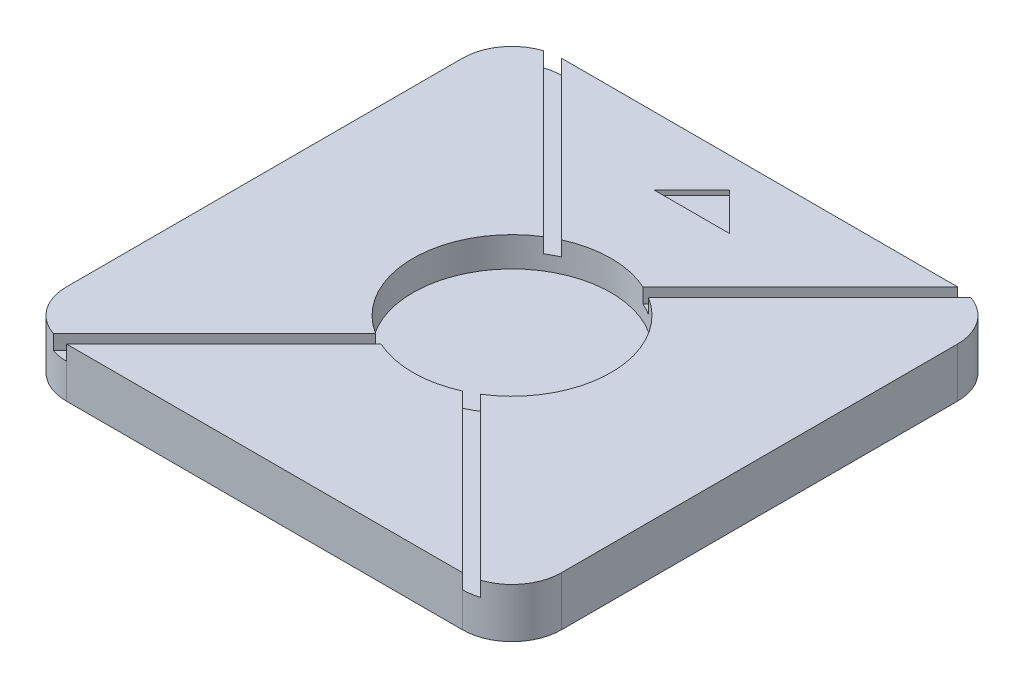
ISO-10303-21;
HEADER;
FILE_DESCRIPTION(('STEP AP214'),'2;1');
FILE_NAME('part.step','',(''),(''),'','','');
FILE_SCHEMA(('AUTOMOTIVE_DESIGN { 1 0 10303 214 1 1 1 1 }'));
ENDSEC;
DATA;
#1=APPLICATION_CONTEXT('core data for automotive mechanical design processes');
#2=APPLICATION_PROTOCOL_DEFINITION('international standard','automotive_design',2000,#1);
#3=PRODUCT_CONTEXT('',#1,'mechanical');
#4=PRODUCT('Part','Part','',(#3));
#5=PRODUCT_RELATED_PRODUCT_CATEGORY('part','',(#4));
#6=PRODUCT_DEFINITION_FORMATION('','',#4);
#7=PRODUCT_DEFINITION_CONTEXT('part definition',#1,'design');
#8=PRODUCT_DEFINITION('design','',#6,#7);
#9=PRODUCT_DEFINITION_SHAPE('','',#8);
#10=(LENGTH_UNIT() NAMED_UNIT(*) SI_UNIT(.MILLI.,.METRE.));
#11=(NAMED_UNIT(*) PLANE_ANGLE_UNIT() SI_UNIT($,.RADIAN.));
#12=(NAMED_UNIT(*) SI_UNIT($,.STERADIAN.) SOLID_ANGLE_UNIT());
#13=UNCERTAINTY_MEASURE_WITH_UNIT(LENGTH_MEASURE(1.E-05),#10,'distance_accuracy_value','');
#14=(GEOMETRIC_REPRESENTATION_CONTEXT(3) GLOBAL_UNCERTAINTY_ASSIGNED_CONTEXT((#13)) GLOBAL_UNIT_ASSIGNED_CONTEXT((#10,
#11,#12)) REPRESENTATION_CONTEXT('',''));
#15=CARTESIAN_POINT('',(0.,0.,0.));
#16=DIRECTION('',(0.,0.,1.));
#17=DIRECTION('',(1.,0.,0.));
#18=AXIS2_PLACEMENT_3D('',#15,#16,#17);
#19=CARTESIAN_POINT('',(-61.551724137931,10.,40.0000000000001));
#20=DIRECTION('',(0.,-1.,0.));
#21=DIRECTION('',(0.,0.,-1.));
#22=AXIS2_PLACEMENT_3D('',#19,#20,#21);
#23=PLANE('',#22);
#24=DIRECTION('',(0.707106781186547,0.,-0.707106781186548));
#25=VECTOR('',#24,1.);
#26=CARTESIAN_POINT('',(-13.9373844378805,10.,-13.9373844378805));
#27=LINE('',#26,#25);
#28=CARTESIAN_POINT('',(-10.9290245008404,10.,-16.9457443749206));
#29=VERTEX_POINT('',#28);
#30=CARTESIAN_POINT('',(21.6116864027467,10.,-49.4864552785077));
#31=VERTEX_POINT('',#30);
#32=EDGE_CURVE('E308',#29,#31,#27,.T.);
#33=ORIENTED_EDGE('',*,*,#32,.F.);
#34=CARTESIAN_POINT('',(-21.551724137931,10.,0.));
#35=DIRECTION('',(0.,1.,0.));
#36=DIRECTION('',(0.,0.,1.));
#37=AXIS2_PLACEMENT_3D('',#34,#35,#36);
#38=CIRCLE('',#37,20.);
#39=CARTESIAN_POINT('',(-10.9290245008404,10.,16.9457443749207));
#40=VERTEX_POINT('',#39);
#41=EDGE_CURVE('E249',#40,#29,#38,.T.);
#42=ORIENTED_EDGE('',*,*,#41,.F.);
#43=DIRECTION('',(0.707106781186548,0.,0.707106781186547));
#44=VECTOR('',#43,1.);
#45=CARTESIAN_POINT('',(-13.9373844378805,10.,13.9373844378806));
#46=LINE('',#45,#44);
#47=CARTESIAN_POINT('',(21.6116864027468,10.,49.4864552785079));
#48=VERTEX_POINT('',#47);
#49=EDGE_CURVE('E281',#40,#48,#46,.T.);
#50=ORIENTED_EDGE('',*,*,#49,.T.);
#51=CARTESIAN_POINT('',(18.448275862069,10.,40.0000000000001));
#52=DIRECTION('',(0.,1.,0.));
#53=DIRECTION('',(0.,0.,1.));
#54=AXIS2_PLACEMENT_3D('',#51,#52,#53);
#55=CIRCLE('',#54,10.);
#56=CARTESIAN_POINT('',(28.448275862069,10.,40.));
#57=VERTEX_POINT('',#56);
#58=EDGE_CURVE('E377',#48,#57,#55,.T.);
#59=ORIENTED_EDGE('',*,*,#58,.T.);
#60=DIRECTION('',(0.,0.,-1.));
#61=VECTOR('',#60,1.);
#62=CARTESIAN_POINT('',(28.448275862069,10.,-39.9999999999998));
#63=LINE('',#62,#61);
#64=CARTESIAN_POINT('',(28.448275862069,10.,-39.9999999999998));
#65=VERTEX_POINT('',#64);
#66=EDGE_CURVE('E380',#57,#65,#63,.T.);
#67=ORIENTED_EDGE('',*,*,#66,.T.);
#68=CARTESIAN_POINT('',(18.448275862069,10.,-39.9999999999999));
#69=DIRECTION('',(0.,1.,0.));
#70=DIRECTION('',(0.,0.,1.));
#71=AXIS2_PLACEMENT_3D('',#68,#69,#70);
#72=CIRCLE('',#71,10.);
#73=EDGE_CURVE('E383',#65,#31,#72,.T.);
#74=ORIENTED_EDGE('',*,*,#73,.T.);
#75=EDGE_LOOP('',(#33,#42,#50,#59,#67,#74));
#76=FACE_BOUND('',#75,.T.);
#77=ADVANCED_FACE('F39',(#76),#23,.F.);
#78=CARTESIAN_POINT('',(0.,7.,0.));
#79=DIRECTION('',(0.,1.,0.));
#80=DIRECTION('',(0.,0.,1.));
#81=AXIS2_PLACEMENT_3D('',#78,#79,#80);
#82=PLANE('',#81);
#83=CARTESIAN_POINT('',(-21.551724137931,7.,0.));
#84=DIRECTION('',(0.,1.,0.));
#85=DIRECTION('',(0.,0.,1.));
#86=AXIS2_PLACEMENT_3D('',#83,#84,#85);
#87=CIRCLE('',#86,20.);
#88=CARTESIAN_POINT('',(-13.3229675826081,7.,18.228756555323));
#89=VERTEX_POINT('',#88);
#90=CARTESIAN_POINT('',(-10.9290245008404,7.,16.9457443749207));
#91=VERTEX_POINT('',#90);
#92=EDGE_CURVE('E269',#89,#91,#87,.T.);
#93=ORIENTED_EDGE('',*,*,#92,.F.);
#94=DIRECTION('',(-0.707106781186549,0.,-0.707106781186546));
#95=VECTOR('',#94,1.);
#96=CARTESIAN_POINT('',(-15.7758620689655,7.,15.7758620689656));
#97=LINE('',#96,#95);
#98=CARTESIAN_POINT('',(18.448275862069,7.,50.0000000000001));
#99=VERTEX_POINT('',#98);
#100=EDGE_CURVE('E341',#99,#89,#97,.T.);
#101=ORIENTED_EDGE('',*,*,#100,.F.);
#102=CARTESIAN_POINT('',(18.448275862069,7.,40.0000000000001));
#103=DIRECTION('',(0.,1.,0.));
#104=DIRECTION('',(0.,0.,1.));
#105=AXIS2_PLACEMENT_3D('',#102,#103,#104);
#106=CIRCLE('',#105,10.);
#107=CARTESIAN_POINT('',(21.6116864027468,7.,49.4864552785079));
#108=VERTEX_POINT('',#107);
#109=EDGE_CURVE('E345',#99,#108,#106,.T.);
#110=ORIENTED_EDGE('',*,*,#109,.T.);
#111=DIRECTION('',(0.707106781186548,0.,0.707106781186547));
#112=VECTOR('',#111,1.);
#113=CARTESIAN_POINT('',(-13.9373844378805,7.,13.9373844378806));
#114=LINE('',#113,#112);
#115=EDGE_CURVE('E326',#91,#108,#114,.T.);
#116=ORIENTED_EDGE('',*,*,#115,.F.);
#117=EDGE_LOOP('',(#93,#101,#110,#116));
#118=FACE_BOUND('',#117,.T.);
#119=ADVANCED_FACE('F561',(#118),#82,.T.);
#120=CARTESIAN_POINT('',(0.,7.,0.));
#121=DIRECTION('',(0.,1.,0.));
#122=DIRECTION('',(0.,0.,1.));
#123=AXIS2_PLACEMENT_3D('',#120,#121,#122);
#124=PLANE('',#123);
#125=CARTESIAN_POINT('',(-21.551724137931,7.,0.));
#126=DIRECTION('',(0.,1.,0.));
#127=DIRECTION('',(0.,0.,1.));
#128=AXIS2_PLACEMENT_3D('',#125,#126,#127);
#129=CIRCLE('',#128,20.);
#130=CARTESIAN_POINT('',(-10.9290245008404,7.,-16.9457443749206));
#131=VERTEX_POINT('',#130);
#132=CARTESIAN_POINT('',(-13.3229675826081,7.,-18.2287565553229));
#133=VERTEX_POINT('',#132);
#134=EDGE_CURVE('E11',#131,#133,#129,.T.);
#135=ORIENTED_EDGE('',*,*,#134,.F.);
#136=DIRECTION('',(0.707106781186547,0.,-0.707106781186548));
#137=VECTOR('',#136,1.);
#138=CARTESIAN_POINT('',(-13.9373844378805,7.,-13.9373844378805));
#139=LINE('',#138,#137);
#140=CARTESIAN_POINT('',(21.6116864027467,7.,-49.4864552785077));
#141=VERTEX_POINT('',#140);
#142=EDGE_CURVE('E285',#131,#141,#139,.T.);
#143=ORIENTED_EDGE('',*,*,#142,.T.);
#144=CARTESIAN_POINT('',(18.448275862069,7.,-39.9999999999999));
#145=DIRECTION('',(0.,1.,0.));
#146=DIRECTION('',(0.,0.,1.));
#147=AXIS2_PLACEMENT_3D('',#144,#145,#146);
#148=CIRCLE('',#147,10.);
#149=CARTESIAN_POINT('',(18.4482758620689,7.,-49.9999999999999));
#150=VERTEX_POINT('',#149);
#151=EDGE_CURVE('E289',#141,#150,#148,.T.);
#152=ORIENTED_EDGE('',*,*,#151,.T.);
#153=DIRECTION('',(0.707106781186548,0.,-0.707106781186547));
#154=VECTOR('',#153,1.);
#155=CARTESIAN_POINT('',(-15.7758620689655,7.,-15.7758620689655));
#156=LINE('',#155,#154);
#157=EDGE_CURVE('E293',#133,#150,#156,.T.);
#158=ORIENTED_EDGE('',*,*,#157,.F.);
#159=EDGE_LOOP('',(#135,#143,#152,#158));
#160=FACE_BOUND('',#159,.T.);
#161=ADVANCED_FACE('F546',(#160),#124,.T.);
#162=CARTESIAN_POINT('',(-61.551724137931,10.,40.0000000000001));
#163=DIRECTION('',(0.,-1.,0.));
#164=DIRECTION('',(0.,0.,-1.));
#165=AXIS2_PLACEMENT_3D('',#162,#163,#164);
#166=CYLINDRICAL_SURFACE('',#165,10.);
#167=DIRECTION('',(0.,1.,0.));
#168=VECTOR('',#167,1.);
#169=CARTESIAN_POINT('',(-64.7151346786088,7.,49.4864552785079));
#170=LINE('',#169,#168);
#171=CARTESIAN_POINT('',(-64.7151346786088,7.,49.4864552785079));
#172=VERTEX_POINT('',#171);
#173=CARTESIAN_POINT('',(-64.7151346786088,10.,49.4864552785079));
#174=VERTEX_POINT('',#173);
#175=EDGE_CURVE('E349',#172,#174,#170,.T.);
#176=ORIENTED_EDGE('',*,*,#175,.T.);
#177=CARTESIAN_POINT('',(-61.551724137931,10.,40.0000000000001));
#178=DIRECTION('',(0.,1.,0.));
#179=DIRECTION('',(0.,0.,-1.));
#180=AXIS2_PLACEMENT_3D('',#177,#178,#179);
#181=CIRCLE('',#180,10.);
#182=CARTESIAN_POINT('',(-71.551724137931,10.,40.));
#183=VERTEX_POINT('',#182);
#184=EDGE_CURVE('E368',#183,#174,#181,.T.);
#185=ORIENTED_EDGE('',*,*,#184,.F.);
#186=DIRECTION('',(0.,-1.,0.));
#187=VECTOR('',#186,1.);
#188=CARTESIAN_POINT('',(-71.551724137931,10.,40.));
#189=LINE('',#188,#187);
#190=CARTESIAN_POINT('',(-71.551724137931,0.,40.));
#191=VERTEX_POINT('',#190);
#192=EDGE_CURVE('E397',#183,#191,#189,.T.);
#193=ORIENTED_EDGE('',*,*,#192,.T.);
#194=CARTESIAN_POINT('',(-61.551724137931,0.,40.0000000000001));
#195=DIRECTION('',(0.,1.,0.));
#196=DIRECTION('',(0.,0.,-1.));
#197=AXIS2_PLACEMENT_3D('',#194,#195,#196);
#198=CIRCLE('',#197,10.);
#199=CARTESIAN_POINT('',(-61.551724137931,0.,50.0000000000001));
#200=VERTEX_POINT('',#199);
#201=EDGE_CURVE('E322',#191,#200,#198,.T.);
#202=ORIENTED_EDGE('',*,*,#201,.T.);
#203=DIRECTION('',(0.,-1.,0.));
#204=VECTOR('',#203,1.);
#205=CARTESIAN_POINT('',(-61.551724137931,10.,50.0000000000001));
#206=LINE('',#205,#204);
#207=CARTESIAN_POINT('',(-61.551724137931,7.,50.0000000000001));
#208=VERTEX_POINT('',#207);
#209=EDGE_CURVE('E451',#208,#200,#206,.T.);
#210=ORIENTED_EDGE('',*,*,#209,.F.);
#211=CARTESIAN_POINT('',(-61.551724137931,7.,40.0000000000001));
#212=DIRECTION('',(0.,1.,0.));
#213=DIRECTION('',(0.,0.,1.));
#214=AXIS2_PLACEMENT_3D('',#211,#212,#213);
#215=CIRCLE('',#214,10.);
#216=EDGE_CURVE('E334',#172,#208,#215,.T.);
#217=ORIENTED_EDGE('',*,*,#216,.F.);
#218=EDGE_LOOP('',(#176,#185,#193,#202,#210,#217));
#219=FACE_BOUND('',#218,.T.);
#220=ADVANCED_FACE('F41',(#219),#166,.T.);
#221=CARTESIAN_POINT('',(18.448275862069,10.,40.0000000000001));
#222=DIRECTION('',(0.,-1.,0.));
#223=DIRECTION('',(0.,0.,-1.));
#224=AXIS2_PLACEMENT_3D('',#221,#222,#223);
#225=CYLINDRICAL_SURFACE('',#224,10.);
#226=DIRECTION('',(0.,1.,0.));
#227=VECTOR('',#226,1.);
#228=CARTESIAN_POINT('',(21.6116864027468,7.,49.4864552785079));
#229=LINE('',#228,#227);
#230=EDGE_CURVE('E309',#108,#48,#229,.T.);
#231=ORIENTED_EDGE('',*,*,#230,.F.);
#232=ORIENTED_EDGE('',*,*,#109,.F.);
#233=DIRECTION('',(0.,-1.,0.));
#234=VECTOR('',#233,1.);
#235=CARTESIAN_POINT('',(18.4482758620689,10.,50.0000000000001));
#236=LINE('',#235,#234);
#237=CARTESIAN_POINT('',(18.4482758620689,0.,50.0000000000001));
#238=VERTEX_POINT('',#237);
#239=EDGE_CURVE('E448',#99,#238,#236,.T.);
#240=ORIENTED_EDGE('',*,*,#239,.T.);
#241=CARTESIAN_POINT('',(18.448275862069,0.,40.0000000000001));
#242=DIRECTION('',(0.,1.,0.));
#243=DIRECTION('',(0.,0.,1.));
#244=AXIS2_PLACEMENT_3D('',#241,#242,#243);
#245=CIRCLE('',#244,10.);
#246=CARTESIAN_POINT('',(28.448275862069,0.,40.));
#247=VERTEX_POINT('',#246);
#248=EDGE_CURVE('E405',#238,#247,#245,.T.);
#249=ORIENTED_EDGE('',*,*,#248,.T.);
#250=DIRECTION('',(0.,-1.,0.));
#251=VECTOR('',#250,1.);
#252=CARTESIAN_POINT('',(28.448275862069,10.,40.));
#253=LINE('',#252,#251);
#254=EDGE_CURVE('E444',#57,#247,#253,.T.);
#255=ORIENTED_EDGE('',*,*,#254,.F.);
#256=ORIENTED_EDGE('',*,*,#58,.F.);
#257=EDGE_LOOP('',(#231,#232,#240,#249,#255,#256));
#258=FACE_BOUND('',#257,.T.);
#259=ADVANCED_FACE('F507',(#258),#225,.T.);
#260=CARTESIAN_POINT('',(-61.551724137931,10.,-39.9999999999999));
#261=DIRECTION('',(0.,-1.,0.));
#262=DIRECTION('',(0.,0.,-1.));
#263=AXIS2_PLACEMENT_3D('',#260,#261,#262);
#264=CYLINDRICAL_SURFACE('',#263,10.);
#265=DIRECTION('',(0.,1.,0.));
#266=VECTOR('',#265,1.);
#267=CARTESIAN_POINT('',(-64.7151346786088,7.,-49.4864552785077));
#268=LINE('',#267,#266);
#269=CARTESIAN_POINT('',(-64.7151346786088,7.,-49.4864552785077));
#270=VERTEX_POINT('',#269);
#271=CARTESIAN_POINT('',(-64.7151346786088,10.,-49.4864552785077));
#272=VERTEX_POINT('',#271);
#273=EDGE_CURVE('E318',#270,#272,#268,.T.);
#274=ORIENTED_EDGE('',*,*,#273,.F.);
#275=CARTESIAN_POINT('',(-61.551724137931,7.,-39.9999999999999));
#276=DIRECTION('',(0.,1.,0.));
#277=DIRECTION('',(0.,0.,1.));
#278=AXIS2_PLACEMENT_3D('',#275,#276,#277);
#279=CIRCLE('',#278,10.);
#280=CARTESIAN_POINT('',(-61.551724137931,7.,-49.9999999999999));
#281=VERTEX_POINT('',#280);
#282=EDGE_CURVE('E300',#281,#270,#279,.T.);
#283=ORIENTED_EDGE('',*,*,#282,.F.);
#284=DIRECTION('',(0.,-1.,0.));
#285=VECTOR('',#284,1.);
#286=CARTESIAN_POINT('',(-61.551724137931,10.,-49.9999999999999));
#287=LINE('',#286,#285);
#288=CARTESIAN_POINT('',(-61.551724137931,0.,-49.9999999999999));
#289=VERTEX_POINT('',#288);
#290=EDGE_CURVE('E431',#281,#289,#287,.T.);
#291=ORIENTED_EDGE('',*,*,#290,.T.);
#292=CARTESIAN_POINT('',(-61.551724137931,0.,-39.9999999999999));
#293=DIRECTION('',(0.,1.,0.));
#294=DIRECTION('',(0.,0.,1.));
#295=AXIS2_PLACEMENT_3D('',#292,#293,#294);
#296=CIRCLE('',#295,10.);
#297=CARTESIAN_POINT('',(-71.551724137931,0.,-39.9999999999998));
#298=VERTEX_POINT('',#297);
#299=EDGE_CURVE('E419',#289,#298,#296,.T.);
#300=ORIENTED_EDGE('',*,*,#299,.T.);
#301=DIRECTION('',(0.,-1.,0.));
#302=VECTOR('',#301,1.);
#303=CARTESIAN_POINT('',(-71.551724137931,10.,-39.9999999999998));
#304=LINE('',#303,#302);
#305=CARTESIAN_POINT('',(-71.551724137931,10.,-39.9999999999998));
#306=VERTEX_POINT('',#305);
#307=EDGE_CURVE('E427',#306,#298,#304,.T.);
#308=ORIENTED_EDGE('',*,*,#307,.F.);
#309=CARTESIAN_POINT('',(-61.551724137931,10.,-39.9999999999999));
#310=DIRECTION('',(0.,1.,0.));
#311=DIRECTION('',(0.,0.,1.));
#312=AXIS2_PLACEMENT_3D('',#309,#310,#311);
#313=CIRCLE('',#312,10.);
#314=EDGE_CURVE('E391',#272,#306,#313,.T.);
#315=ORIENTED_EDGE('',*,*,#314,.F.);
#316=EDGE_LOOP('',(#274,#283,#291,#300,#308,#315));
#317=FACE_BOUND('',#316,.T.);
#318=ADVANCED_FACE('F483',(#317),#264,.T.);
#319=DIRECTION('',(-0.707106781186548,0.,0.707106781186547));
#320=VECTOR('',#319,1.);
#321=CARTESIAN_POINT('',(-21.551724137931,10.,-43.9409498441566));
#322=LINE('',#321,#320);
#323=CARTESIAN_POINT('',(-21.551724137931,10.,-43.9409498441566));
#324=VERTEX_POINT('',#323);
#325=CARTESIAN_POINT('',(-29.1900916111388,10.,-36.3025823709489));
#326=VERTEX_POINT('',#325);
#327=EDGE_CURVE('E230',#324,#326,#322,.T.);
#328=ORIENTED_EDGE('',*,*,#327,.F.);
#329=DIRECTION('',(-0.707106781186547,0.,-0.707106781186548));
#330=VECTOR('',#329,1.);
#331=CARTESIAN_POINT('',(-13.9133566647233,10.,-36.3025823709489));
#332=LINE('',#331,#330);
#333=CARTESIAN_POINT('',(-13.9133566647233,10.,-36.3025823709489));
#334=VERTEX_POINT('',#333);
#335=EDGE_CURVE('E55',#334,#324,#332,.T.);
#336=ORIENTED_EDGE('',*,*,#335,.F.);
#337=DIRECTION('',(1.,0.,0.));
#338=VECTOR('',#337,1.);
#339=CARTESIAN_POINT('',(-29.1900916111388,10.,-36.3025823709489));
#340=LINE('',#339,#338);
#341=EDGE_CURVE('E226',#326,#334,#340,.T.);
#342=ORIENTED_EDGE('',*,*,#341,.F.);
#343=EDGE_LOOP('',(#328,#336,#342));
#344=FACE_BOUND('',#343,.T.);
#345=DIRECTION('',(0.707106781186548,0.,0.707106781186547));
#346=VECTOR('',#345,1.);
#347=CARTESIAN_POINT('',(-5.77586206896548,10.,5.77586206896549));
#348=LINE('',#347,#346);
#349=CARTESIAN_POINT('',(-61.551724137931,10.,-49.9999999999999));
#350=VERTEX_POINT('',#349);
#351=CARTESIAN_POINT('',(-29.7804806932539,10.,-18.2287565553229));
#352=VERTEX_POINT('',#351);
#353=EDGE_CURVE('E286',#350,#352,#348,.T.);
#354=ORIENTED_EDGE('',*,*,#353,.T.);
#355=CARTESIAN_POINT('',(-13.3229675826081,10.,-18.2287565553229));
#356=VERTEX_POINT('',#355);
#357=EDGE_CURVE('E514',#356,#352,#38,.T.);
#358=ORIENTED_EDGE('',*,*,#357,.F.);
#359=DIRECTION('',(0.707106781186548,0.,-0.707106781186547));
#360=VECTOR('',#359,1.);
#361=CARTESIAN_POINT('',(-15.7758620689655,10.,-15.7758620689655));
#362=LINE('',#361,#360);
#363=CARTESIAN_POINT('',(18.4482758620689,10.,-49.9999999999999));
#364=VERTEX_POINT('',#363);
#365=EDGE_CURVE('E312',#356,#364,#362,.T.);
#366=ORIENTED_EDGE('',*,*,#365,.T.);
#367=DIRECTION('',(-1.,0.,0.));
#368=VECTOR('',#367,1.);
#369=CARTESIAN_POINT('',(-61.551724137931,10.,-49.9999999999999));
#370=LINE('',#369,#368);
#371=EDGE_CURVE('E387',#364,#350,#370,.T.);
#372=ORIENTED_EDGE('',*,*,#371,.T.);
#373=EDGE_LOOP('',(#354,#358,#366,#372));
#374=FACE_BOUND('',#373,.T.);
#375=ADVANCED_FACE('F537',(#344,#374),#23,.F.);
#376=DIRECTION('',(0.707106781186547,0.,-0.707106781186548));
#377=VECTOR('',#376,1.);
#378=CARTESIAN_POINT('',(-7.61433970005047,10.,-7.61433970005047));
#379=LINE('',#378,#377);
#380=CARTESIAN_POINT('',(-32.1744237750216,10.,16.9457443749207));
#381=VERTEX_POINT('',#380);
#382=EDGE_CURVE('E352',#174,#381,#379,.T.);
#383=ORIENTED_EDGE('',*,*,#382,.T.);
#384=CARTESIAN_POINT('',(-32.1744237750217,10.,-16.9457443749206));
#385=VERTEX_POINT('',#384);
#386=EDGE_CURVE('E252',#385,#381,#38,.T.);
#387=ORIENTED_EDGE('',*,*,#386,.F.);
#388=DIRECTION('',(-0.707106781186548,0.,-0.707106781186547));
#389=VECTOR('',#388,1.);
#390=CARTESIAN_POINT('',(-7.61433970005053,10.,7.61433970005054));
#391=LINE('',#390,#389);
#392=EDGE_CURVE('E305',#385,#272,#391,.T.);
#393=ORIENTED_EDGE('',*,*,#392,.T.);
#394=ORIENTED_EDGE('',*,*,#314,.T.);
#395=DIRECTION('',(0.,0.,1.));
#396=VECTOR('',#395,1.);
#397=CARTESIAN_POINT('',(-71.551724137931,10.,-39.9999999999998));
#398=LINE('',#397,#396);
#399=EDGE_CURVE('E394',#306,#183,#398,.T.);
#400=ORIENTED_EDGE('',*,*,#399,.T.);
#401=ORIENTED_EDGE('',*,*,#184,.T.);
#402=EDGE_LOOP('',(#383,#387,#393,#394,#400,#401));
#403=FACE_BOUND('',#402,.T.);
#404=ADVANCED_FACE('F527',(#403),#23,.F.);
#405=DIRECTION('',(-0.707106781186549,0.,-0.707106781186546));
#406=VECTOR('',#405,1.);
#407=CARTESIAN_POINT('',(-15.7758620689655,10.,15.7758620689656));
#408=LINE('',#407,#406);
#409=CARTESIAN_POINT('',(18.448275862069,10.,50.0000000000001));
#410=VERTEX_POINT('',#409);
#411=CARTESIAN_POINT('',(-13.3229675826081,10.,18.228756555323));
#412=VERTEX_POINT('',#411);
#413=EDGE_CURVE('E330',#410,#412,#408,.T.);
#414=ORIENTED_EDGE('',*,*,#413,.T.);
#415=CARTESIAN_POINT('',(-29.7804806932539,10.,18.2287565553231));
#416=VERTEX_POINT('',#415);
#417=EDGE_CURVE('E242',#416,#412,#38,.T.);
#418=ORIENTED_EDGE('',*,*,#417,.F.);
#419=DIRECTION('',(-0.707106781186547,0.,0.707106781186548));
#420=VECTOR('',#419,1.);
#421=CARTESIAN_POINT('',(-5.77586206896543,10.,-5.77586206896543));
#422=LINE('',#421,#420);
#423=CARTESIAN_POINT('',(-61.551724137931,10.,50.0000000000001));
#424=VERTEX_POINT('',#423);
#425=EDGE_CURVE('E356',#416,#424,#422,.T.);
#426=ORIENTED_EDGE('',*,*,#425,.T.);
#427=DIRECTION('',(1.,0.,0.));
#428=VECTOR('',#427,1.);
#429=CARTESIAN_POINT('',(-61.551724137931,10.,50.0000000000001));
#430=LINE('',#429,#428);
#431=EDGE_CURVE('E372',#424,#410,#430,.T.);
#432=ORIENTED_EDGE('',*,*,#431,.T.);
#433=EDGE_LOOP('',(#414,#418,#426,#432));
#434=FACE_BOUND('',#433,.T.);
#435=ADVANCED_FACE('F566',(#434),#23,.F.);
#436=CARTESIAN_POINT('',(-61.551724137931,10.,50.0000000000001));
#437=DIRECTION('',(0.,0.,-1.));
#438=DIRECTION('',(-1.,0.,0.));
#439=AXIS2_PLACEMENT_3D('',#436,#437,#438);
#440=PLANE('',#439);
#441=DIRECTION('',(1.,0.,0.));
#442=VECTOR('',#441,1.);
#443=CARTESIAN_POINT('',(-61.551724137931,0.,50.0000000000001));
#444=LINE('',#443,#442);
#445=EDGE_CURVE('E401',#200,#238,#444,.T.);
#446=ORIENTED_EDGE('',*,*,#445,.T.);
#447=ORIENTED_EDGE('',*,*,#239,.F.);
#448=EDGE_CURVE('E449',#410,#99,#236,.T.);
#449=ORIENTED_EDGE('',*,*,#448,.F.);
#450=ORIENTED_EDGE('',*,*,#431,.F.);
#451=EDGE_CURVE('E452',#424,#208,#206,.T.);
#452=ORIENTED_EDGE('',*,*,#451,.T.);
#453=ORIENTED_EDGE('',*,*,#209,.T.);
#454=EDGE_LOOP('',(#446,#447,#449,#450,#452,#453));
#455=FACE_BOUND('',#454,.T.);
#456=ADVANCED_FACE('F462',(#455),#440,.F.);
#457=CARTESIAN_POINT('',(28.448275862069,10.,-39.9999999999998));
#458=DIRECTION('',(-1.,0.,0.));
#459=DIRECTION('',(0.,0.,1.));
#460=AXIS2_PLACEMENT_3D('',#457,#458,#459);
#461=PLANE('',#460);
#462=DIRECTION('',(0.,0.,-1.));
#463=VECTOR('',#462,1.);
#464=CARTESIAN_POINT('',(28.448275862069,0.,-39.9999999999998));
#465=LINE('',#464,#463);
#466=CARTESIAN_POINT('',(28.448275862069,0.,-39.9999999999998));
#467=VERTEX_POINT('',#466);
#468=EDGE_CURVE('E408',#247,#467,#465,.T.);
#469=ORIENTED_EDGE('',*,*,#468,.T.);
#470=DIRECTION('',(0.,-1.,0.));
#471=VECTOR('',#470,1.);
#472=CARTESIAN_POINT('',(28.448275862069,10.,-39.9999999999998));
#473=LINE('',#472,#471);
#474=EDGE_CURVE('E440',#65,#467,#473,.T.);
#475=ORIENTED_EDGE('',*,*,#474,.F.);
#476=ORIENTED_EDGE('',*,*,#66,.F.);
#477=ORIENTED_EDGE('',*,*,#254,.T.);
#478=EDGE_LOOP('',(#469,#475,#476,#477));
#479=FACE_BOUND('',#478,.T.);
#480=ADVANCED_FACE('F501',(#479),#461,.F.);
#481=CARTESIAN_POINT('',(18.448275862069,10.,-39.9999999999999));
#482=DIRECTION('',(0.,-1.,0.));
#483=DIRECTION('',(0.,0.,-1.));
#484=AXIS2_PLACEMENT_3D('',#481,#482,#483);
#485=CYLINDRICAL_SURFACE('',#484,10.);
#486=ORIENTED_EDGE('',*,*,#151,.F.);
#487=DIRECTION('',(0.,1.,0.));
#488=VECTOR('',#487,1.);
#489=CARTESIAN_POINT('',(21.6116864027467,7.,-49.4864552785077));
#490=LINE('',#489,#488);
#491=EDGE_CURVE('E304',#141,#31,#490,.T.);
#492=ORIENTED_EDGE('',*,*,#491,.T.);
#493=ORIENTED_EDGE('',*,*,#73,.F.);
#494=ORIENTED_EDGE('',*,*,#474,.T.);
#495=CARTESIAN_POINT('',(18.448275862069,0.,-39.9999999999999));
#496=DIRECTION('',(0.,1.,0.));
#497=DIRECTION('',(0.,0.,1.));
#498=AXIS2_PLACEMENT_3D('',#495,#496,#497);
#499=CIRCLE('',#498,10.);
#500=CARTESIAN_POINT('',(18.4482758620689,0.,-49.9999999999999));
#501=VERTEX_POINT('',#500);
#502=EDGE_CURVE('E411',#467,#501,#499,.T.);
#503=ORIENTED_EDGE('',*,*,#502,.T.);
#504=DIRECTION('',(0.,-1.,0.));
#505=VECTOR('',#504,1.);
#506=CARTESIAN_POINT('',(18.4482758620689,10.,-49.9999999999999));
#507=LINE('',#506,#505);
#508=EDGE_CURVE('E435',#150,#501,#507,.T.);
#509=ORIENTED_EDGE('',*,*,#508,.F.);
#510=EDGE_LOOP('',(#486,#492,#493,#494,#503,#509));
#511=FACE_BOUND('',#510,.T.);
#512=ADVANCED_FACE('F497',(#511),#485,.T.);
#513=CARTESIAN_POINT('',(-61.551724137931,10.,-49.9999999999999));
#514=DIRECTION('',(0.,0.,1.));
#515=DIRECTION('',(1.,0.,0.));
#516=AXIS2_PLACEMENT_3D('',#513,#514,#515);
#517=PLANE('',#516);
#518=DIRECTION('',(-1.,0.,0.));
#519=VECTOR('',#518,1.);
#520=CARTESIAN_POINT('',(-61.551724137931,0.,-49.9999999999999));
#521=LINE('',#520,#519);
#522=EDGE_CURVE('E415',#501,#289,#521,.T.);
#523=ORIENTED_EDGE('',*,*,#522,.T.);
#524=ORIENTED_EDGE('',*,*,#290,.F.);
#525=EDGE_CURVE('E432',#350,#281,#287,.T.);
#526=ORIENTED_EDGE('',*,*,#525,.F.);
#527=ORIENTED_EDGE('',*,*,#371,.F.);
#528=EDGE_CURVE('E436',#364,#150,#507,.T.);
#529=ORIENTED_EDGE('',*,*,#528,.T.);
#530=ORIENTED_EDGE('',*,*,#508,.T.);
#531=EDGE_LOOP('',(#523,#524,#526,#527,#529,#530));
#532=FACE_BOUND('',#531,.T.);
#533=ADVANCED_FACE('F490',(#532),#517,.F.);
#534=CARTESIAN_POINT('',(-71.551724137931,10.,-39.9999999999998));
#535=DIRECTION('',(1.,0.,0.));
#536=DIRECTION('',(0.,0.,-1.));
#537=AXIS2_PLACEMENT_3D('',#534,#535,#536);
#538=PLANE('',#537);
#539=DIRECTION('',(0.,0.,1.));
#540=VECTOR('',#539,1.);
#541=CARTESIAN_POINT('',(-71.551724137931,0.,-39.9999999999998));
#542=LINE('',#541,#540);
#543=EDGE_CURVE('E373',#298,#191,#542,.T.);
#544=ORIENTED_EDGE('',*,*,#543,.T.);
#545=ORIENTED_EDGE('',*,*,#192,.F.);
#546=ORIENTED_EDGE('',*,*,#399,.F.);
#547=ORIENTED_EDGE('',*,*,#307,.T.);
#548=EDGE_LOOP('',(#544,#545,#546,#547));
#549=FACE_BOUND('',#548,.T.);
#550=ADVANCED_FACE('F476',(#549),#538,.F.);
#551=CARTESIAN_POINT('',(-61.551724137931,0.,40.0000000000001));
#552=DIRECTION('',(0.,-1.,0.));
#553=DIRECTION('',(0.,0.,-1.));
#554=AXIS2_PLACEMENT_3D('',#551,#552,#553);
#555=PLANE('',#554);
#556=ORIENTED_EDGE('',*,*,#201,.F.);
#557=ORIENTED_EDGE('',*,*,#543,.F.);
#558=ORIENTED_EDGE('',*,*,#299,.F.);
#559=ORIENTED_EDGE('',*,*,#522,.F.);
#560=ORIENTED_EDGE('',*,*,#502,.F.);
#561=ORIENTED_EDGE('',*,*,#468,.F.);
#562=ORIENTED_EDGE('',*,*,#248,.F.);
#563=ORIENTED_EDGE('',*,*,#445,.F.);
#564=EDGE_LOOP('',(#556,#557,#558,#559,#560,#561,#562,#563));
#565=FACE_BOUND('',#564,.T.);
#566=ADVANCED_FACE('F469',(#565),#555,.T.);
#567=CARTESIAN_POINT('',(-13.9373844378805,7.,13.9373844378806));
#568=DIRECTION('',(-0.707106781186547,0.,0.707106781186548));
#569=DIRECTION('',(0.707106781186548,0.,0.707106781186547));
#570=AXIS2_PLACEMENT_3D('',#567,#568,#569);
#571=PLANE('',#570);
#572=DIRECTION('',(0.,1.,0.));
#573=VECTOR('',#572,1.);
#574=CARTESIAN_POINT('',(-10.9290245008404,4.,16.9457443749207));
#575=LINE('',#574,#573);
#576=EDGE_CURVE('E278',#91,#40,#575,.T.);
#577=ORIENTED_EDGE('',*,*,#576,.F.);
#578=ORIENTED_EDGE('',*,*,#115,.T.);
#579=ORIENTED_EDGE('',*,*,#230,.T.);
#580=ORIENTED_EDGE('',*,*,#49,.F.);
#581=EDGE_LOOP('',(#577,#578,#579,#580));
#582=FACE_BOUND('',#581,.T.);
#583=ADVANCED_FACE('F556',(#582),#571,.T.);
#584=CARTESIAN_POINT('',(-15.7758620689655,7.,15.7758620689656));
#585=DIRECTION('',(0.707106781186546,0.,-0.707106781186549));
#586=DIRECTION('',(-0.707106781186549,0.,-0.707106781186546));
#587=AXIS2_PLACEMENT_3D('',#584,#585,#586);
#588=PLANE('',#587);
#589=DIRECTION('',(0.,1.,0.));
#590=VECTOR('',#589,1.);
#591=CARTESIAN_POINT('',(-13.3229675826081,4.,18.228756555323));
#592=LINE('',#591,#590);
#593=EDGE_CURVE('E275',#412,#89,#592,.F.);
#594=ORIENTED_EDGE('',*,*,#593,.F.);
#595=ORIENTED_EDGE('',*,*,#413,.F.);
#596=ORIENTED_EDGE('',*,*,#448,.T.);
#597=ORIENTED_EDGE('',*,*,#100,.T.);
#598=EDGE_LOOP('',(#594,#595,#596,#597));
#599=FACE_BOUND('',#598,.T.);
#600=ADVANCED_FACE('F564',(#599),#588,.T.);
#601=CARTESIAN_POINT('',(-5.77586206896543,7.,-5.77586206896543));
#602=DIRECTION('',(-0.707106781186548,0.,-0.707106781186547));
#603=DIRECTION('',(-0.707106781186547,0.,0.707106781186548));
#604=AXIS2_PLACEMENT_3D('',#601,#602,#603);
#605=PLANE('',#604);
#606=DIRECTION('',(0.,1.,0.));
#607=VECTOR('',#606,1.);
#608=CARTESIAN_POINT('',(-29.7804806932539,4.,18.2287565553231));
#609=LINE('',#608,#607);
#610=CARTESIAN_POINT('',(-29.7804806932539,7.,18.2287565553231));
#611=VERTEX_POINT('',#610);
#612=EDGE_CURVE('E272',#611,#416,#609,.T.);
#613=ORIENTED_EDGE('',*,*,#612,.F.);
#614=DIRECTION('',(-0.707106781186547,0.,0.707106781186548));
#615=VECTOR('',#614,1.);
#616=CARTESIAN_POINT('',(-5.77586206896543,7.,-5.77586206896543));
#617=LINE('',#616,#615);
#618=EDGE_CURVE('E338',#611,#208,#617,.T.);
#619=ORIENTED_EDGE('',*,*,#618,.T.);
#620=ORIENTED_EDGE('',*,*,#451,.F.);
#621=ORIENTED_EDGE('',*,*,#425,.F.);
#622=EDGE_LOOP('',(#613,#619,#620,#621));
#623=FACE_BOUND('',#622,.T.);
#624=ADVANCED_FACE('F571',(#623),#605,.T.);
#625=CARTESIAN_POINT('',(-7.61433970005047,7.,-7.61433970005047));
#626=DIRECTION('',(0.707106781186548,0.,0.707106781186547));
#627=DIRECTION('',(0.707106781186547,0.,-0.707106781186548));
#628=AXIS2_PLACEMENT_3D('',#625,#626,#627);
#629=PLANE('',#628);
#630=DIRECTION('',(0.,1.,0.));
#631=VECTOR('',#630,1.);
#632=CARTESIAN_POINT('',(-32.1744237750216,4.,16.9457443749207));
#633=LINE('',#632,#631);
#634=CARTESIAN_POINT('',(-32.1744237750216,7.,16.9457443749207));
#635=VERTEX_POINT('',#634);
#636=EDGE_CURVE('E268',#381,#635,#633,.F.);
#637=ORIENTED_EDGE('',*,*,#636,.F.);
#638=ORIENTED_EDGE('',*,*,#382,.F.);
#639=ORIENTED_EDGE('',*,*,#175,.F.);
#640=DIRECTION('',(0.707106781186547,0.,-0.707106781186548));
#641=VECTOR('',#640,1.);
#642=CARTESIAN_POINT('',(-7.61433970005047,7.,-7.61433970005047));
#643=LINE('',#642,#641);
#644=EDGE_CURVE('E329',#172,#635,#643,.T.);
#645=ORIENTED_EDGE('',*,*,#644,.T.);
#646=EDGE_LOOP('',(#637,#638,#639,#645));
#647=FACE_BOUND('',#646,.T.);
#648=ADVANCED_FACE('F525',(#647),#629,.T.);
#649=EDGE_CURVE('E265',#635,#611,#87,.T.);
#650=ORIENTED_EDGE('',*,*,#649,.F.);
#651=ORIENTED_EDGE('',*,*,#644,.F.);
#652=ORIENTED_EDGE('',*,*,#216,.T.);
#653=ORIENTED_EDGE('',*,*,#618,.F.);
#654=EDGE_LOOP('',(#650,#651,#652,#653));
#655=FACE_BOUND('',#654,.T.);
#656=ADVANCED_FACE('F574',(#655),#82,.T.);
#657=CARTESIAN_POINT('',(-7.61433970005053,7.,7.61433970005054));
#658=DIRECTION('',(0.707106781186547,0.,-0.707106781186548));
#659=DIRECTION('',(-0.707106781186548,0.,-0.707106781186547));
#660=AXIS2_PLACEMENT_3D('',#657,#658,#659);
#661=PLANE('',#660);
#662=DIRECTION('',(0.,1.,0.));
#663=VECTOR('',#662,1.);
#664=CARTESIAN_POINT('',(-32.1744237750217,4.,-16.9457443749206));
#665=LINE('',#664,#663);
#666=CARTESIAN_POINT('',(-32.1744237750217,7.,-16.9457443749206));
#667=VERTEX_POINT('',#666);
#668=EDGE_CURVE('E255',#667,#385,#665,.T.);
#669=ORIENTED_EDGE('',*,*,#668,.F.);
#670=DIRECTION('',(-0.707106781186548,0.,-0.707106781186547));
#671=VECTOR('',#670,1.);
#672=CARTESIAN_POINT('',(-7.61433970005053,7.,7.61433970005054));
#673=LINE('',#672,#671);
#674=EDGE_CURVE('E282',#667,#270,#673,.T.);
#675=ORIENTED_EDGE('',*,*,#674,.T.);
#676=ORIENTED_EDGE('',*,*,#273,.T.);
#677=ORIENTED_EDGE('',*,*,#392,.F.);
#678=EDGE_LOOP('',(#669,#675,#676,#677));
#679=FACE_BOUND('',#678,.T.);
#680=ADVANCED_FACE('F529',(#679),#661,.T.);
#681=CARTESIAN_POINT('',(-5.77586206896548,7.,5.77586206896549));
#682=DIRECTION('',(-0.707106781186547,0.,0.707106781186548));
#683=DIRECTION('',(0.707106781186548,0.,0.707106781186547));
#684=AXIS2_PLACEMENT_3D('',#681,#682,#683);
#685=PLANE('',#684);
#686=DIRECTION('',(0.,1.,0.));
#687=VECTOR('',#686,1.);
#688=CARTESIAN_POINT('',(-29.7804806932539,4.,-18.2287565553229));
#689=LINE('',#688,#687);
#690=CARTESIAN_POINT('',(-29.7804806932539,7.,-18.2287565553229));
#691=VERTEX_POINT('',#690);
#692=EDGE_CURVE('E63',#352,#691,#689,.F.);
#693=ORIENTED_EDGE('',*,*,#692,.F.);
#694=ORIENTED_EDGE('',*,*,#353,.F.);
#695=ORIENTED_EDGE('',*,*,#525,.T.);
#696=DIRECTION('',(0.707106781186548,0.,0.707106781186547));
#697=VECTOR('',#696,1.);
#698=CARTESIAN_POINT('',(-5.77586206896548,7.,5.77586206896549));
#699=LINE('',#698,#697);
#700=EDGE_CURVE('E296',#281,#691,#699,.T.);
#701=ORIENTED_EDGE('',*,*,#700,.T.);
#702=EDGE_LOOP('',(#693,#694,#695,#701));
#703=FACE_BOUND('',#702,.T.);
#704=ADVANCED_FACE('F535',(#703),#685,.T.);
#705=CARTESIAN_POINT('',(-15.7758620689655,7.,-15.7758620689655));
#706=DIRECTION('',(0.707106781186547,0.,0.707106781186548));
#707=DIRECTION('',(0.707106781186548,0.,-0.707106781186547));
#708=AXIS2_PLACEMENT_3D('',#705,#706,#707);
#709=PLANE('',#708);
#710=DIRECTION('',(0.,1.,0.));
#711=VECTOR('',#710,1.);
#712=CARTESIAN_POINT('',(-13.3229675826081,4.,-18.2287565553229));
#713=LINE('',#712,#711);
#714=EDGE_CURVE('E262',#133,#356,#713,.T.);
#715=ORIENTED_EDGE('',*,*,#714,.F.);
#716=ORIENTED_EDGE('',*,*,#157,.T.);
#717=ORIENTED_EDGE('',*,*,#528,.F.);
#718=ORIENTED_EDGE('',*,*,#365,.F.);
#719=EDGE_LOOP('',(#715,#716,#717,#718));
#720=FACE_BOUND('',#719,.T.);
#721=ADVANCED_FACE('F542',(#720),#709,.T.);
#722=CARTESIAN_POINT('',(-13.9373844378805,7.,-13.9373844378805));
#723=DIRECTION('',(0.707106781186548,0.,0.707106781186547));
#724=DIRECTION('',(0.707106781186547,0.,-0.707106781186548));
#725=AXIS2_PLACEMENT_3D('',#722,#723,#724);
#726=PLANE('',#725);
#727=ORIENTED_EDGE('',*,*,#142,.F.);
#728=DIRECTION('',(0.,1.,0.));
#729=VECTOR('',#728,1.);
#730=CARTESIAN_POINT('',(-10.9290245008404,4.,-16.9457443749206));
#731=LINE('',#730,#729);
#732=EDGE_CURVE('E258',#131,#29,#731,.T.);
#733=ORIENTED_EDGE('',*,*,#732,.T.);
#734=ORIENTED_EDGE('',*,*,#32,.T.);
#735=ORIENTED_EDGE('',*,*,#491,.F.);
#736=EDGE_LOOP('',(#727,#733,#734,#735));
#737=FACE_BOUND('',#736,.T.);
#738=ADVANCED_FACE('F575',(#737),#726,.F.);
#739=EDGE_CURVE('E43',#691,#667,#129,.T.);
#740=ORIENTED_EDGE('',*,*,#739,.F.);
#741=ORIENTED_EDGE('',*,*,#700,.F.);
#742=ORIENTED_EDGE('',*,*,#282,.T.);
#743=ORIENTED_EDGE('',*,*,#674,.F.);
#744=EDGE_LOOP('',(#740,#741,#742,#743));
#745=FACE_BOUND('',#744,.T.);
#746=ADVANCED_FACE('F533',(#745),#124,.T.);
#747=CARTESIAN_POINT('',(-21.551724137931,4.,0.));
#748=DIRECTION('',(0.,1.,0.));
#749=DIRECTION('',(0.,0.,1.));
#750=AXIS2_PLACEMENT_3D('',#747,#748,#749);
#751=CYLINDRICAL_SURFACE('',#750,20.);
#752=ORIENTED_EDGE('',*,*,#576,.T.);
#753=ORIENTED_EDGE('',*,*,#41,.T.);
#754=ORIENTED_EDGE('',*,*,#732,.F.);
#755=ORIENTED_EDGE('',*,*,#134,.T.);
#756=ORIENTED_EDGE('',*,*,#714,.T.);
#757=ORIENTED_EDGE('',*,*,#357,.T.);
#758=ORIENTED_EDGE('',*,*,#692,.T.);
#759=ORIENTED_EDGE('',*,*,#739,.T.);
#760=ORIENTED_EDGE('',*,*,#668,.T.);
#761=ORIENTED_EDGE('',*,*,#386,.T.);
#762=ORIENTED_EDGE('',*,*,#636,.T.);
#763=ORIENTED_EDGE('',*,*,#649,.T.);
#764=ORIENTED_EDGE('',*,*,#612,.T.);
#765=ORIENTED_EDGE('',*,*,#417,.T.);
#766=ORIENTED_EDGE('',*,*,#593,.T.);
#767=ORIENTED_EDGE('',*,*,#92,.T.);
#768=EDGE_LOOP('',(#752,#753,#754,#755,#756,#757,#758,#759,#760,#761,#762,#763,#764,#765,#766,#767));
#769=FACE_BOUND('',#768,.T.);
#770=CARTESIAN_POINT('',(-21.551724137931,4.,0.));
#771=DIRECTION('',(0.,1.,0.));
#772=DIRECTION('',(0.,0.,1.));
#773=AXIS2_PLACEMENT_3D('',#770,#771,#772);
#774=CIRCLE('',#773,20.);
#775=CARTESIAN_POINT('',(-21.551724137931,4.,20.0000000000001));
#776=VERTEX_POINT('',#775);
#777=EDGE_CURVE('E245',#776,#776,#774,.T.);
#778=ORIENTED_EDGE('',*,*,#777,.F.);
#779=EDGE_LOOP('',(#778));
#780=FACE_BOUND('',#779,.T.);
#781=ADVANCED_FACE('F518',(#769,#780),#751,.F.);
#782=CARTESIAN_POINT('',(-21.551724137931,4.,0.));
#783=DIRECTION('',(0.,1.,0.));
#784=DIRECTION('',(0.,0.,1.));
#785=AXIS2_PLACEMENT_3D('',#782,#783,#784);
#786=PLANE('',#785);
#787=ORIENTED_EDGE('',*,*,#777,.T.);
#788=EDGE_LOOP('',(#787));
#789=FACE_BOUND('',#788,.T.);
#790=ADVANCED_FACE('F639',(#789),#786,.T.);
#791=CARTESIAN_POINT('',(-13.9133566647233,9.,-36.3025823709489));
#792=DIRECTION('',(0.707106781186548,0.,-0.707106781186547));
#793=DIRECTION('',(-0.707106781186547,0.,-0.707106781186548));
#794=AXIS2_PLACEMENT_3D('',#791,#792,#793);
#795=PLANE('',#794);
#796=ORIENTED_EDGE('',*,*,#335,.T.);
#797=DIRECTION('',(0.,1.,0.));
#798=VECTOR('',#797,1.);
#799=CARTESIAN_POINT('',(-21.551724137931,9.,-43.9409498441566));
#800=LINE('',#799,#798);
#801=CARTESIAN_POINT('',(-21.551724137931,9.,-43.9409498441566));
#802=VERTEX_POINT('',#801);
#803=EDGE_CURVE('E204',#802,#324,#800,.T.);
#804=ORIENTED_EDGE('',*,*,#803,.F.);
#805=DIRECTION('',(-0.707106781186547,0.,-0.707106781186548));
#806=VECTOR('',#805,1.);
#807=CARTESIAN_POINT('',(-13.9133566647233,9.,-36.3025823709489));
#808=LINE('',#807,#806);
#809=CARTESIAN_POINT('',(-13.9133566647233,9.,-36.3025823709489));
#810=VERTEX_POINT('',#809);
#811=EDGE_CURVE('E208',#810,#802,#808,.T.);
#812=ORIENTED_EDGE('',*,*,#811,.F.);
#813=DIRECTION('',(0.,1.,0.));
#814=VECTOR('',#813,1.);
#815=CARTESIAN_POINT('',(-13.9133566647233,9.,-36.3025823709489));
#816=LINE('',#815,#814);
#817=EDGE_CURVE('E239',#810,#334,#816,.T.);
#818=ORIENTED_EDGE('',*,*,#817,.T.);
#819=EDGE_LOOP('',(#796,#804,#812,#818));
#820=FACE_BOUND('',#819,.T.);
#821=ADVANCED_FACE('F206',(#820),#795,.F.);
#822=CARTESIAN_POINT('',(-29.1900916111388,9.,-36.3025823709489));
#823=DIRECTION('',(0.,0.,1.));
#824=DIRECTION('',(1.,0.,0.));
#825=AXIS2_PLACEMENT_3D('',#822,#823,#824);
#826=PLANE('',#825);
#827=ORIENTED_EDGE('',*,*,#341,.T.);
#828=ORIENTED_EDGE('',*,*,#817,.F.);
#829=DIRECTION('',(1.,0.,0.));
#830=VECTOR('',#829,1.);
#831=CARTESIAN_POINT('',(-29.1900916111388,9.,-36.3025823709489));
#832=LINE('',#831,#830);
#833=CARTESIAN_POINT('',(-29.1900916111388,9.,-36.3025823709489));
#834=VERTEX_POINT('',#833);
#835=EDGE_CURVE('E215',#834,#810,#832,.T.);
#836=ORIENTED_EDGE('',*,*,#835,.F.);
#837=DIRECTION('',(0.,1.,0.));
#838=VECTOR('',#837,1.);
#839=CARTESIAN_POINT('',(-29.1900916111388,9.,-36.3025823709489));
#840=LINE('',#839,#838);
#841=EDGE_CURVE('E214',#834,#326,#840,.T.);
#842=ORIENTED_EDGE('',*,*,#841,.T.);
#843=EDGE_LOOP('',(#827,#828,#836,#842));
#844=FACE_BOUND('',#843,.T.);
#845=ADVANCED_FACE('F645',(#844),#826,.F.);
#846=CARTESIAN_POINT('',(-21.551724137931,9.,-43.9409498441566));
#847=DIRECTION('',(-0.707106781186547,0.,-0.707106781186548));
#848=DIRECTION('',(-0.707106781186548,0.,0.707106781186547));
#849=AXIS2_PLACEMENT_3D('',#846,#847,#848);
#850=PLANE('',#849);
#851=ORIENTED_EDGE('',*,*,#327,.T.);
#852=ORIENTED_EDGE('',*,*,#841,.F.);
#853=DIRECTION('',(-0.707106781186548,0.,0.707106781186547));
#854=VECTOR('',#853,1.);
#855=CARTESIAN_POINT('',(-21.551724137931,9.,-43.9409498441566));
#856=LINE('',#855,#854);
#857=EDGE_CURVE('E218',#802,#834,#856,.T.);
#858=ORIENTED_EDGE('',*,*,#857,.F.);
#859=ORIENTED_EDGE('',*,*,#803,.T.);
#860=EDGE_LOOP('',(#851,#852,#858,#859));
#861=FACE_BOUND('',#860,.T.);
#862=ADVANCED_FACE('F219',(#861),#850,.F.);
#863=CARTESIAN_POINT('',(0.,9.,0.));
#864=DIRECTION('',(0.,1.,0.));
#865=DIRECTION('',(0.,0.,1.));
#866=AXIS2_PLACEMENT_3D('',#863,#864,#865);
#867=PLANE('',#866);
#868=ORIENTED_EDGE('',*,*,#811,.T.);
#869=ORIENTED_EDGE('',*,*,#857,.T.);
#870=ORIENTED_EDGE('',*,*,#835,.T.);
#871=EDGE_LOOP('',(#868,#869,#870));
#872=FACE_BOUND('',#871,.T.);
#873=ADVANCED_FACE('F224',(#872),#867,.T.);
#874=CLOSED_SHELL('',(#77,#119,#161,#220,#259,#318,#375,#404,#435,#456,#480,#512,#533,#550,#566,
#583,#600,#624,#648,#656,#680,#704,#721,#738,#746,#781,#790,#821,#845,#862,#873));
#875=MANIFOLD_SOLID_BREP('B2',#874);
#876=ADVANCED_BREP_SHAPE_REPRESENTATION('',(#18,#875),#14);
#877=SHAPE_DEFINITION_REPRESENTATION(#9,#876);
ENDSEC;
END-ISO-10303-21;
